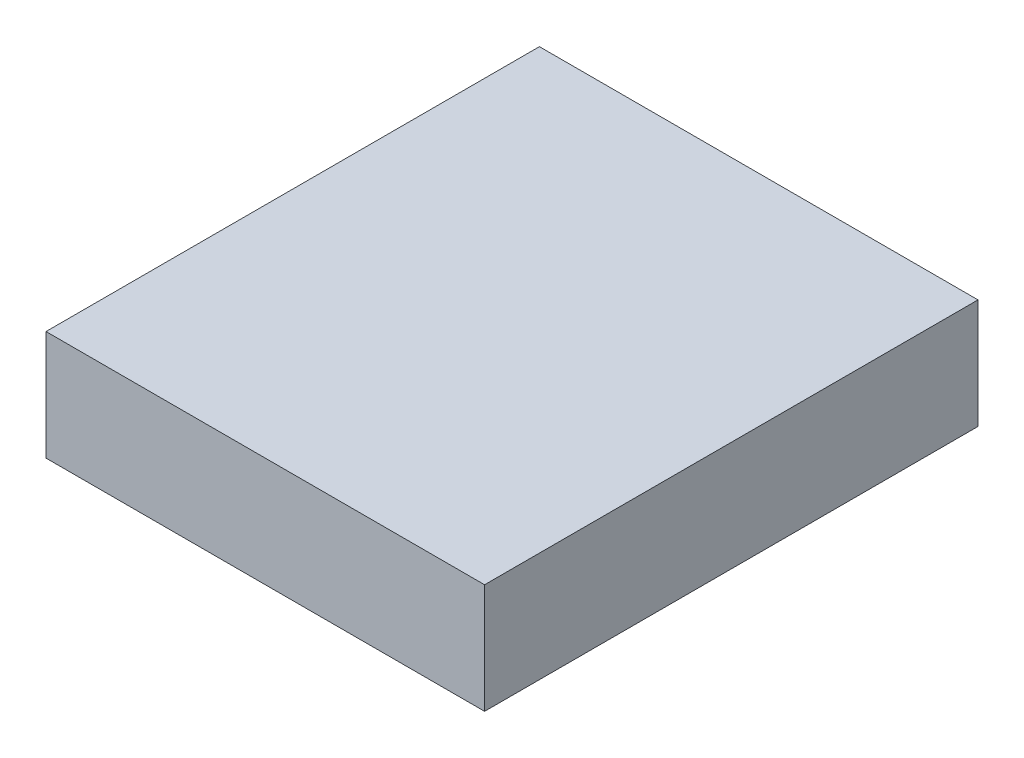
ISO-10303-21;
HEADER;
FILE_DESCRIPTION(('STEP AP214'),'2;1');
FILE_NAME('part.step','',(''),(''),'','','');
FILE_SCHEMA(('AUTOMOTIVE_DESIGN { 1 0 10303 214 1 1 1 1 }'));
ENDSEC;
DATA;
#1=APPLICATION_CONTEXT('core data for automotive mechanical design processes');
#2=APPLICATION_PROTOCOL_DEFINITION('international standard','automotive_design',2000,#1);
#3=PRODUCT_CONTEXT('',#1,'mechanical');
#4=PRODUCT('Part','Part','',(#3));
#5=PRODUCT_RELATED_PRODUCT_CATEGORY('part','',(#4));
#6=PRODUCT_DEFINITION_FORMATION('','',#4);
#7=PRODUCT_DEFINITION_CONTEXT('part definition',#1,'design');
#8=PRODUCT_DEFINITION('design','',#6,#7);
#9=PRODUCT_DEFINITION_SHAPE('','',#8);
#10=(LENGTH_UNIT() NAMED_UNIT(*) SI_UNIT(.MILLI.,.METRE.));
#11=(NAMED_UNIT(*) PLANE_ANGLE_UNIT() SI_UNIT($,.RADIAN.));
#12=(NAMED_UNIT(*) SI_UNIT($,.STERADIAN.) SOLID_ANGLE_UNIT());
#13=UNCERTAINTY_MEASURE_WITH_UNIT(LENGTH_MEASURE(1.E-05),#10,'distance_accuracy_value','');
#14=(GEOMETRIC_REPRESENTATION_CONTEXT(3) GLOBAL_UNCERTAINTY_ASSIGNED_CONTEXT((#13)) GLOBAL_UNIT_ASSIGNED_CONTEXT((#10,
#11,#12)) REPRESENTATION_CONTEXT('',''));
#15=CARTESIAN_POINT('',(0.,0.,0.));
#16=DIRECTION('',(0.,0.,1.));
#17=DIRECTION('',(1.,0.,0.));
#18=AXIS2_PLACEMENT_3D('',#15,#16,#17);
#19=CARTESIAN_POINT('',(0.,0.,0.));
#20=DIRECTION('',(0.,1.,0.));
#21=DIRECTION('',(0.,0.,1.));
#22=AXIS2_PLACEMENT_3D('',#19,#20,#21);
#23=PLANE('',#22);
#24=DIRECTION('',(-1.,0.,0.));
#25=VECTOR('',#24,1.);
#26=CARTESIAN_POINT('',(-2.,0.,2.25));
#27=LINE('',#26,#25);
#28=CARTESIAN_POINT('',(2.,0.,2.25));
#29=VERTEX_POINT('',#28);
#30=CARTESIAN_POINT('',(-2.,0.,2.25));
#31=VERTEX_POINT('',#30);
#32=EDGE_CURVE('E81',#29,#31,#27,.T.);
#33=ORIENTED_EDGE('',*,*,#32,.T.);
#34=DIRECTION('',(0.,0.,-1.));
#35=VECTOR('',#34,1.);
#36=CARTESIAN_POINT('',(-2.,0.,-2.25));
#37=LINE('',#36,#35);
#38=CARTESIAN_POINT('',(-2.,0.,-2.25));
#39=VERTEX_POINT('',#38);
#40=EDGE_CURVE('E68',#31,#39,#37,.T.);
#41=ORIENTED_EDGE('',*,*,#40,.T.);
#42=DIRECTION('',(1.,0.,0.));
#43=VECTOR('',#42,1.);
#44=CARTESIAN_POINT('',(-2.,0.,-2.25));
#45=LINE('',#44,#43);
#46=CARTESIAN_POINT('',(2.,0.,-2.25));
#47=VERTEX_POINT('',#46);
#48=EDGE_CURVE('E55',#39,#47,#45,.T.);
#49=ORIENTED_EDGE('',*,*,#48,.T.);
#50=DIRECTION('',(0.,0.,1.));
#51=VECTOR('',#50,1.);
#52=CARTESIAN_POINT('',(2.,0.,-2.25));
#53=LINE('',#52,#51);
#54=EDGE_CURVE('E20',#47,#29,#53,.T.);
#55=ORIENTED_EDGE('',*,*,#54,.T.);
#56=EDGE_LOOP('',(#33,#41,#49,#55));
#57=FACE_BOUND('',#56,.T.);
#58=ADVANCED_FACE('F17',(#57),#23,.F.);
#59=CARTESIAN_POINT('',(2.,1.,-2.25));
#60=DIRECTION('',(-1.,0.,0.));
#61=DIRECTION('',(0.,0.,1.));
#62=AXIS2_PLACEMENT_3D('',#59,#60,#61);
#63=PLANE('',#62);
#64=DIRECTION('',(0.,1.,0.));
#65=VECTOR('',#64,1.);
#66=CARTESIAN_POINT('',(2.,1.,-2.25));
#67=LINE('',#66,#65);
#68=CARTESIAN_POINT('',(2.,1.,-2.25));
#69=VERTEX_POINT('',#68);
#70=EDGE_CURVE('E61',#47,#69,#67,.T.);
#71=ORIENTED_EDGE('',*,*,#70,.T.);
#72=DIRECTION('',(0.,0.,1.));
#73=VECTOR('',#72,1.);
#74=CARTESIAN_POINT('',(2.,1.,0.));
#75=LINE('',#74,#73);
#76=CARTESIAN_POINT('',(2.,1.,2.25));
#77=VERTEX_POINT('',#76);
#78=EDGE_CURVE('E83',#77,#69,#75,.F.);
#79=ORIENTED_EDGE('',*,*,#78,.F.);
#80=DIRECTION('',(0.,1.,0.));
#81=VECTOR('',#80,1.);
#82=CARTESIAN_POINT('',(2.,1.,2.25));
#83=LINE('',#82,#81);
#84=EDGE_CURVE('E64',#77,#29,#83,.F.);
#85=ORIENTED_EDGE('',*,*,#84,.T.);
#86=ORIENTED_EDGE('',*,*,#54,.F.);
#87=EDGE_LOOP('',(#71,#79,#85,#86));
#88=FACE_BOUND('',#87,.T.);
#89=ADVANCED_FACE('F60',(#88),#63,.F.);
#90=CARTESIAN_POINT('',(-2.,1.,-2.25));
#91=DIRECTION('',(0.,0.,1.));
#92=DIRECTION('',(1.,0.,0.));
#93=AXIS2_PLACEMENT_3D('',#90,#91,#92);
#94=PLANE('',#93);
#95=DIRECTION('',(0.,1.,0.));
#96=VECTOR('',#95,1.);
#97=CARTESIAN_POINT('',(-2.,1.,-2.25));
#98=LINE('',#97,#96);
#99=CARTESIAN_POINT('',(-2.,1.,-2.25));
#100=VERTEX_POINT('',#99);
#101=EDGE_CURVE('E70',#39,#100,#98,.T.);
#102=ORIENTED_EDGE('',*,*,#101,.T.);
#103=DIRECTION('',(1.,0.,0.));
#104=VECTOR('',#103,1.);
#105=CARTESIAN_POINT('',(0.,1.,-2.25));
#106=LINE('',#105,#104);
#107=EDGE_CURVE('E74',#69,#100,#106,.F.);
#108=ORIENTED_EDGE('',*,*,#107,.F.);
#109=ORIENTED_EDGE('',*,*,#70,.F.);
#110=ORIENTED_EDGE('',*,*,#48,.F.);
#111=EDGE_LOOP('',(#102,#108,#109,#110));
#112=FACE_BOUND('',#111,.T.);
#113=ADVANCED_FACE('F72',(#112),#94,.F.);
#114=CARTESIAN_POINT('',(-2.,1.,-2.25));
#115=DIRECTION('',(1.,0.,0.));
#116=DIRECTION('',(0.,0.,-1.));
#117=AXIS2_PLACEMENT_3D('',#114,#115,#116);
#118=PLANE('',#117);
#119=DIRECTION('',(0.,1.,0.));
#120=VECTOR('',#119,1.);
#121=CARTESIAN_POINT('',(-2.,1.,2.25));
#122=LINE('',#121,#120);
#123=CARTESIAN_POINT('',(-2.,1.,2.25));
#124=VERTEX_POINT('',#123);
#125=EDGE_CURVE('E35',#31,#124,#122,.T.);
#126=ORIENTED_EDGE('',*,*,#125,.T.);
#127=DIRECTION('',(0.,0.,1.));
#128=VECTOR('',#127,1.);
#129=CARTESIAN_POINT('',(-2.,1.,0.));
#130=LINE('',#129,#128);
#131=EDGE_CURVE('E26',#100,#124,#130,.T.);
#132=ORIENTED_EDGE('',*,*,#131,.F.);
#133=ORIENTED_EDGE('',*,*,#101,.F.);
#134=ORIENTED_EDGE('',*,*,#40,.F.);
#135=EDGE_LOOP('',(#126,#132,#133,#134));
#136=FACE_BOUND('',#135,.T.);
#137=ADVANCED_FACE('F89',(#136),#118,.F.);
#138=CARTESIAN_POINT('',(-2.,1.,2.25));
#139=DIRECTION('',(0.,0.,-1.));
#140=DIRECTION('',(-1.,0.,0.));
#141=AXIS2_PLACEMENT_3D('',#138,#139,#140);
#142=PLANE('',#141);
#143=ORIENTED_EDGE('',*,*,#84,.F.);
#144=DIRECTION('',(1.,0.,0.));
#145=VECTOR('',#144,1.);
#146=CARTESIAN_POINT('',(0.,1.,2.25));
#147=LINE('',#146,#145);
#148=EDGE_CURVE('E11',#124,#77,#147,.T.);
#149=ORIENTED_EDGE('',*,*,#148,.F.);
#150=ORIENTED_EDGE('',*,*,#125,.F.);
#151=ORIENTED_EDGE('',*,*,#32,.F.);
#152=EDGE_LOOP('',(#143,#149,#150,#151));
#153=FACE_BOUND('',#152,.T.);
#154=ADVANCED_FACE('F91',(#153),#142,.F.);
#155=CARTESIAN_POINT('',(0.,1.,0.));
#156=DIRECTION('',(0.,1.,0.));
#157=DIRECTION('',(0.,0.,1.));
#158=AXIS2_PLACEMENT_3D('',#155,#156,#157);
#159=PLANE('',#158);
#160=ORIENTED_EDGE('',*,*,#131,.T.);
#161=ORIENTED_EDGE('',*,*,#148,.T.);
#162=ORIENTED_EDGE('',*,*,#78,.T.);
#163=ORIENTED_EDGE('',*,*,#107,.T.);
#164=EDGE_LOOP('',(#160,#161,#162,#163));
#165=FACE_BOUND('',#164,.T.);
#166=ADVANCED_FACE('F88',(#165),#159,.T.);
#167=CLOSED_SHELL('',(#58,#89,#113,#137,#154,#166));
#168=MANIFOLD_SOLID_BREP('B1',#167);
#169=ADVANCED_BREP_SHAPE_REPRESENTATION('',(#18,#168),#14);
#170=SHAPE_DEFINITION_REPRESENTATION(#9,#169);
ENDSEC;
END-ISO-10303-21;
